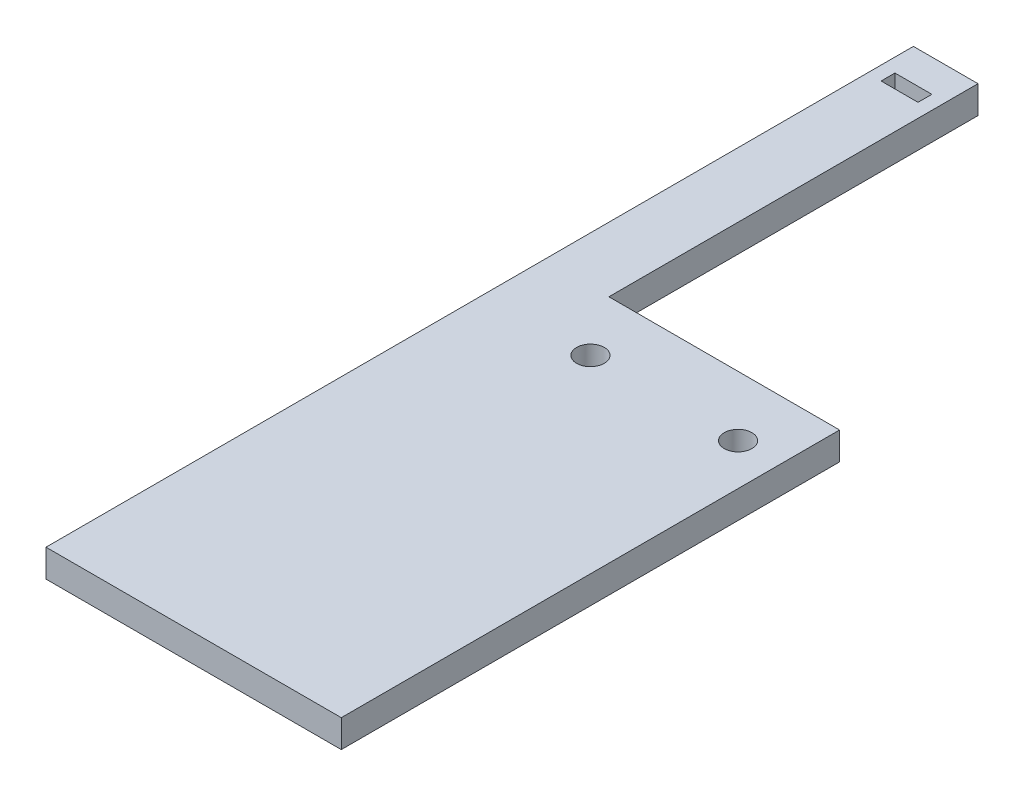
ISO-10303-21;
HEADER;
FILE_DESCRIPTION(('STEP AP214'),'2;1');
FILE_NAME('part.step','',(''),(''),'','','');
FILE_SCHEMA(('AUTOMOTIVE_DESIGN { 1 0 10303 214 1 1 1 1 }'));
ENDSEC;
DATA;
#1=APPLICATION_CONTEXT('core data for automotive mechanical design processes');
#2=APPLICATION_PROTOCOL_DEFINITION('international standard','automotive_design',2000,#1);
#3=PRODUCT_CONTEXT('',#1,'mechanical');
#4=PRODUCT('Part','Part','',(#3));
#5=PRODUCT_RELATED_PRODUCT_CATEGORY('part','',(#4));
#6=PRODUCT_DEFINITION_FORMATION('','',#4);
#7=PRODUCT_DEFINITION_CONTEXT('part definition',#1,'design');
#8=PRODUCT_DEFINITION('design','',#6,#7);
#9=PRODUCT_DEFINITION_SHAPE('','',#8);
#10=(LENGTH_UNIT() NAMED_UNIT(*) SI_UNIT(.MILLI.,.METRE.));
#11=(NAMED_UNIT(*) PLANE_ANGLE_UNIT() SI_UNIT($,.RADIAN.));
#12=(NAMED_UNIT(*) SI_UNIT($,.STERADIAN.) SOLID_ANGLE_UNIT());
#13=UNCERTAINTY_MEASURE_WITH_UNIT(LENGTH_MEASURE(1.E-05),#10,'distance_accuracy_value','');
#14=(GEOMETRIC_REPRESENTATION_CONTEXT(3) GLOBAL_UNCERTAINTY_ASSIGNED_CONTEXT((#13)) GLOBAL_UNIT_ASSIGNED_CONTEXT((#10,
#11,#12)) REPRESENTATION_CONTEXT('',''));
#15=CARTESIAN_POINT('',(0.,0.,0.));
#16=DIRECTION('',(0.,0.,1.));
#17=DIRECTION('',(1.,0.,0.));
#18=AXIS2_PLACEMENT_3D('',#15,#16,#17);
#19=CARTESIAN_POINT('',(0.,3.,0.));
#20=DIRECTION('',(0.,-1.,0.));
#21=DIRECTION('',(0.,0.,-1.));
#22=AXIS2_PLACEMENT_3D('',#19,#20,#21);
#23=PLANE('',#22);
#24=CARTESIAN_POINT('',(11.5,3.,-47.5));
#25=DIRECTION('',(0.,1.,0.));
#26=DIRECTION('',(0.,0.,1.));
#27=AXIS2_PLACEMENT_3D('',#24,#25,#26);
#28=CIRCLE('',#27,1.5);
#29=CARTESIAN_POINT('',(11.5,3.,-46.));
#30=VERTEX_POINT('',#29);
#31=EDGE_CURVE('E167',#30,#30,#28,.T.);
#32=ORIENTED_EDGE('',*,*,#31,.F.);
#33=EDGE_LOOP('',(#32));
#34=FACE_BOUND('',#33,.T.);
#35=CARTESIAN_POINT('',(27.5,3.,-47.5));
#36=DIRECTION('',(0.,1.,0.));
#37=DIRECTION('',(0.,0.,1.));
#38=AXIS2_PLACEMENT_3D('',#35,#36,#37);
#39=CIRCLE('',#38,1.5);
#40=CARTESIAN_POINT('',(27.5,3.,-46.));
#41=VERTEX_POINT('',#40);
#42=EDGE_CURVE('E172',#41,#41,#39,.T.);
#43=ORIENTED_EDGE('',*,*,#42,.F.);
#44=EDGE_LOOP('',(#43));
#45=FACE_BOUND('',#44,.T.);
#46=DIRECTION('',(1.,0.,0.));
#47=VECTOR('',#46,1.);
#48=CARTESIAN_POINT('',(0.,3.,0.));
#49=LINE('',#48,#47);
#50=CARTESIAN_POINT('',(0.,3.,0.));
#51=VERTEX_POINT('',#50);
#52=CARTESIAN_POINT('',(32.,3.,0.));
#53=VERTEX_POINT('',#52);
#54=EDGE_CURVE('E127',#51,#53,#49,.T.);
#55=ORIENTED_EDGE('',*,*,#54,.T.);
#56=DIRECTION('',(0.,0.,1.));
#57=VECTOR('',#56,1.);
#58=CARTESIAN_POINT('',(32.,3.,-94.));
#59=LINE('',#58,#57);
#60=CARTESIAN_POINT('',(32.,3.,-54.));
#61=VERTEX_POINT('',#60);
#62=EDGE_CURVE('E116',#61,#53,#59,.T.);
#63=ORIENTED_EDGE('',*,*,#62,.F.);
#64=DIRECTION('',(-1.,0.,0.));
#65=VECTOR('',#64,1.);
#66=CARTESIAN_POINT('',(7.,3.,-54.));
#67=LINE('',#66,#65);
#68=CARTESIAN_POINT('',(7.,3.,-54.));
#69=VERTEX_POINT('',#68);
#70=EDGE_CURVE('E136',#61,#69,#67,.T.);
#71=ORIENTED_EDGE('',*,*,#70,.T.);
#72=DIRECTION('',(0.,0.,-1.));
#73=VECTOR('',#72,1.);
#74=CARTESIAN_POINT('',(7.,3.,-94.));
#75=LINE('',#74,#73);
#76=CARTESIAN_POINT('',(7.,3.,-94.));
#77=VERTEX_POINT('',#76);
#78=EDGE_CURVE('E138',#69,#77,#75,.T.);
#79=ORIENTED_EDGE('',*,*,#78,.T.);
#80=DIRECTION('',(-1.,0.,0.));
#81=VECTOR('',#80,1.);
#82=CARTESIAN_POINT('',(0.,3.,-94.));
#83=LINE('',#82,#81);
#84=CARTESIAN_POINT('',(0.,3.,-94.));
#85=VERTEX_POINT('',#84);
#86=EDGE_CURVE('E145',#77,#85,#83,.T.);
#87=ORIENTED_EDGE('',*,*,#86,.T.);
#88=DIRECTION('',(0.,0.,1.));
#89=VECTOR('',#88,1.);
#90=CARTESIAN_POINT('',(0.,3.,0.));
#91=LINE('',#90,#89);
#92=EDGE_CURVE('E134',#85,#51,#91,.T.);
#93=ORIENTED_EDGE('',*,*,#92,.T.);
#94=EDGE_LOOP('',(#55,#63,#71,#79,#87,#93));
#95=FACE_BOUND('',#94,.T.);
#96=DIRECTION('',(0.,0.,1.));
#97=VECTOR('',#96,1.);
#98=CARTESIAN_POINT('',(1.5,3.,-90.5));
#99=LINE('',#98,#97);
#100=CARTESIAN_POINT('',(1.5,3.,-90.5));
#101=VERTEX_POINT('',#100);
#102=CARTESIAN_POINT('',(1.5,3.,-89.));
#103=VERTEX_POINT('',#102);
#104=EDGE_CURVE('E181',#101,#103,#99,.T.);
#105=ORIENTED_EDGE('',*,*,#104,.F.);
#106=DIRECTION('',(-1.,0.,0.));
#107=VECTOR('',#106,1.);
#108=CARTESIAN_POINT('',(1.5,3.,-90.5));
#109=LINE('',#108,#107);
#110=CARTESIAN_POINT('',(5.5,3.,-90.5));
#111=VERTEX_POINT('',#110);
#112=EDGE_CURVE('E188',#111,#101,#109,.T.);
#113=ORIENTED_EDGE('',*,*,#112,.F.);
#114=DIRECTION('',(0.,0.,-1.));
#115=VECTOR('',#114,1.);
#116=CARTESIAN_POINT('',(5.5,3.,-90.5));
#117=LINE('',#116,#115);
#118=CARTESIAN_POINT('',(5.5,3.,-89.));
#119=VERTEX_POINT('',#118);
#120=EDGE_CURVE('E186',#119,#111,#117,.T.);
#121=ORIENTED_EDGE('',*,*,#120,.F.);
#122=DIRECTION('',(1.,0.,0.));
#123=VECTOR('',#122,1.);
#124=CARTESIAN_POINT('',(1.5,3.,-89.));
#125=LINE('',#124,#123);
#126=EDGE_CURVE('E183',#103,#119,#125,.T.);
#127=ORIENTED_EDGE('',*,*,#126,.F.);
#128=EDGE_LOOP('',(#105,#113,#121,#127));
#129=FACE_BOUND('',#128,.T.);
#130=ADVANCED_FACE('F40',(#34,#45,#95,#129),#23,.F.);
#131=CARTESIAN_POINT('',(0.,0.,0.));
#132=DIRECTION('',(0.,-1.,0.));
#133=DIRECTION('',(0.,0.,-1.));
#134=AXIS2_PLACEMENT_3D('',#131,#132,#133);
#135=PLANE('',#134);
#136=CARTESIAN_POINT('',(11.5,0.,-47.5));
#137=DIRECTION('',(0.,-1.,0.));
#138=DIRECTION('',(0.,0.,-1.));
#139=AXIS2_PLACEMENT_3D('',#136,#137,#138);
#140=CIRCLE('',#139,1.5);
#141=CARTESIAN_POINT('',(11.5,0.,-49.));
#142=VERTEX_POINT('',#141);
#143=EDGE_CURVE('E44',#142,#142,#140,.T.);
#144=ORIENTED_EDGE('',*,*,#143,.F.);
#145=EDGE_LOOP('',(#144));
#146=FACE_BOUND('',#145,.T.);
#147=CARTESIAN_POINT('',(27.5,0.,-47.5));
#148=DIRECTION('',(0.,-1.,0.));
#149=DIRECTION('',(0.,0.,-1.));
#150=AXIS2_PLACEMENT_3D('',#147,#148,#149);
#151=CIRCLE('',#150,1.5);
#152=CARTESIAN_POINT('',(27.5,0.,-49.));
#153=VERTEX_POINT('',#152);
#154=EDGE_CURVE('E165',#153,#153,#151,.T.);
#155=ORIENTED_EDGE('',*,*,#154,.F.);
#156=EDGE_LOOP('',(#155));
#157=FACE_BOUND('',#156,.T.);
#158=DIRECTION('',(0.,0.,1.));
#159=VECTOR('',#158,1.);
#160=CARTESIAN_POINT('',(32.,0.,-94.));
#161=LINE('',#160,#159);
#162=CARTESIAN_POINT('',(32.,0.,-54.));
#163=VERTEX_POINT('',#162);
#164=CARTESIAN_POINT('',(32.,0.,0.));
#165=VERTEX_POINT('',#164);
#166=EDGE_CURVE('E57',#163,#165,#161,.T.);
#167=ORIENTED_EDGE('',*,*,#166,.T.);
#168=DIRECTION('',(1.,0.,0.));
#169=VECTOR('',#168,1.);
#170=CARTESIAN_POINT('',(0.,0.,0.));
#171=LINE('',#170,#169);
#172=CARTESIAN_POINT('',(0.,0.,0.));
#173=VERTEX_POINT('',#172);
#174=EDGE_CURVE('E130',#173,#165,#171,.T.);
#175=ORIENTED_EDGE('',*,*,#174,.F.);
#176=DIRECTION('',(0.,0.,1.));
#177=VECTOR('',#176,1.);
#178=CARTESIAN_POINT('',(0.,0.,-54.));
#179=LINE('',#178,#177);
#180=CARTESIAN_POINT('',(0.,0.,-94.));
#181=VERTEX_POINT('',#180);
#182=EDGE_CURVE('E140',#181,#173,#179,.T.);
#183=ORIENTED_EDGE('',*,*,#182,.F.);
#184=DIRECTION('',(-1.,0.,0.));
#185=VECTOR('',#184,1.);
#186=CARTESIAN_POINT('',(0.,0.,-94.));
#187=LINE('',#186,#185);
#188=CARTESIAN_POINT('',(7.,0.,-94.));
#189=VERTEX_POINT('',#188);
#190=EDGE_CURVE('E154',#189,#181,#187,.T.);
#191=ORIENTED_EDGE('',*,*,#190,.F.);
#192=DIRECTION('',(0.,0.,-1.));
#193=VECTOR('',#192,1.);
#194=CARTESIAN_POINT('',(7.,0.,-94.));
#195=LINE('',#194,#193);
#196=CARTESIAN_POINT('',(7.,0.,-54.));
#197=VERTEX_POINT('',#196);
#198=EDGE_CURVE('E152',#197,#189,#195,.T.);
#199=ORIENTED_EDGE('',*,*,#198,.F.);
#200=DIRECTION('',(-1.,0.,0.));
#201=VECTOR('',#200,1.);
#202=CARTESIAN_POINT('',(7.,0.,-54.));
#203=LINE('',#202,#201);
#204=EDGE_CURVE('E149',#163,#197,#203,.T.);
#205=ORIENTED_EDGE('',*,*,#204,.F.);
#206=EDGE_LOOP('',(#167,#175,#183,#191,#199,#205));
#207=FACE_BOUND('',#206,.T.);
#208=DIRECTION('',(-1.,0.,0.));
#209=VECTOR('',#208,1.);
#210=CARTESIAN_POINT('',(1.5,0.,-90.5));
#211=LINE('',#210,#209);
#212=CARTESIAN_POINT('',(5.5,0.,-90.5));
#213=VERTEX_POINT('',#212);
#214=CARTESIAN_POINT('',(1.5,0.,-90.5));
#215=VERTEX_POINT('',#214);
#216=EDGE_CURVE('E184',#213,#215,#211,.T.);
#217=ORIENTED_EDGE('',*,*,#216,.T.);
#218=DIRECTION('',(0.,0.,1.));
#219=VECTOR('',#218,1.);
#220=CARTESIAN_POINT('',(1.5,0.,-90.5));
#221=LINE('',#220,#219);
#222=CARTESIAN_POINT('',(1.5,0.,-89.));
#223=VERTEX_POINT('',#222);
#224=EDGE_CURVE('E179',#215,#223,#221,.T.);
#225=ORIENTED_EDGE('',*,*,#224,.T.);
#226=DIRECTION('',(1.,0.,0.));
#227=VECTOR('',#226,1.);
#228=CARTESIAN_POINT('',(1.5,0.,-89.));
#229=LINE('',#228,#227);
#230=CARTESIAN_POINT('',(5.5,0.,-89.));
#231=VERTEX_POINT('',#230);
#232=EDGE_CURVE('E193',#223,#231,#229,.T.);
#233=ORIENTED_EDGE('',*,*,#232,.T.);
#234=DIRECTION('',(0.,0.,-1.));
#235=VECTOR('',#234,1.);
#236=CARTESIAN_POINT('',(5.5,0.,-90.5));
#237=LINE('',#236,#235);
#238=EDGE_CURVE('E196',#231,#213,#237,.T.);
#239=ORIENTED_EDGE('',*,*,#238,.T.);
#240=EDGE_LOOP('',(#217,#225,#233,#239));
#241=FACE_BOUND('',#240,.T.);
#242=ADVANCED_FACE('F214',(#146,#157,#207,#241),#135,.T.);
#243=CARTESIAN_POINT('',(0.,3.,0.));
#244=DIRECTION('',(0.,0.,-1.));
#245=DIRECTION('',(-1.,0.,0.));
#246=AXIS2_PLACEMENT_3D('',#243,#244,#245);
#247=PLANE('',#246);
#248=ORIENTED_EDGE('',*,*,#174,.T.);
#249=DIRECTION('',(0.,-1.,0.));
#250=VECTOR('',#249,1.);
#251=CARTESIAN_POINT('',(32.,0.,0.));
#252=LINE('',#251,#250);
#253=EDGE_CURVE('E119',#53,#165,#252,.T.);
#254=ORIENTED_EDGE('',*,*,#253,.F.);
#255=ORIENTED_EDGE('',*,*,#54,.F.);
#256=DIRECTION('',(0.,-1.,0.));
#257=VECTOR('',#256,1.);
#258=CARTESIAN_POINT('',(0.,3.,0.));
#259=LINE('',#258,#257);
#260=EDGE_CURVE('E49',#51,#173,#259,.T.);
#261=ORIENTED_EDGE('',*,*,#260,.T.);
#262=EDGE_LOOP('',(#248,#254,#255,#261));
#263=FACE_BOUND('',#262,.T.);
#264=ADVANCED_FACE('F42',(#263),#247,.F.);
#265=CARTESIAN_POINT('',(7.,3.,-54.));
#266=DIRECTION('',(0.,0.,1.));
#267=DIRECTION('',(1.,0.,0.));
#268=AXIS2_PLACEMENT_3D('',#265,#266,#267);
#269=PLANE('',#268);
#270=ORIENTED_EDGE('',*,*,#70,.F.);
#271=DIRECTION('',(0.,-1.,0.));
#272=VECTOR('',#271,1.);
#273=CARTESIAN_POINT('',(32.,3.,-54.));
#274=LINE('',#273,#272);
#275=EDGE_CURVE('E11',#61,#163,#274,.T.);
#276=ORIENTED_EDGE('',*,*,#275,.T.);
#277=ORIENTED_EDGE('',*,*,#204,.T.);
#278=DIRECTION('',(0.,-1.,0.));
#279=VECTOR('',#278,1.);
#280=CARTESIAN_POINT('',(7.,3.,-54.));
#281=LINE('',#280,#279);
#282=EDGE_CURVE('E162',#69,#197,#281,.T.);
#283=ORIENTED_EDGE('',*,*,#282,.F.);
#284=EDGE_LOOP('',(#270,#276,#277,#283));
#285=FACE_BOUND('',#284,.T.);
#286=ADVANCED_FACE('F253',(#285),#269,.F.);
#287=CARTESIAN_POINT('',(7.,3.,-94.));
#288=DIRECTION('',(-1.,0.,0.));
#289=DIRECTION('',(0.,0.,1.));
#290=AXIS2_PLACEMENT_3D('',#287,#288,#289);
#291=PLANE('',#290);
#292=ORIENTED_EDGE('',*,*,#198,.T.);
#293=DIRECTION('',(0.,-1.,0.));
#294=VECTOR('',#293,1.);
#295=CARTESIAN_POINT('',(7.,3.,-94.));
#296=LINE('',#295,#294);
#297=EDGE_CURVE('E159',#77,#189,#296,.T.);
#298=ORIENTED_EDGE('',*,*,#297,.F.);
#299=ORIENTED_EDGE('',*,*,#78,.F.);
#300=ORIENTED_EDGE('',*,*,#282,.T.);
#301=EDGE_LOOP('',(#292,#298,#299,#300));
#302=FACE_BOUND('',#301,.T.);
#303=ADVANCED_FACE('F250',(#302),#291,.F.);
#304=CARTESIAN_POINT('',(0.,3.,-94.));
#305=DIRECTION('',(0.,0.,1.));
#306=DIRECTION('',(1.,0.,0.));
#307=AXIS2_PLACEMENT_3D('',#304,#305,#306);
#308=PLANE('',#307);
#309=ORIENTED_EDGE('',*,*,#190,.T.);
#310=DIRECTION('',(0.,-1.,0.));
#311=VECTOR('',#310,1.);
#312=CARTESIAN_POINT('',(0.,3.,-94.));
#313=LINE('',#312,#311);
#314=EDGE_CURVE('E147',#85,#181,#313,.T.);
#315=ORIENTED_EDGE('',*,*,#314,.F.);
#316=ORIENTED_EDGE('',*,*,#86,.F.);
#317=ORIENTED_EDGE('',*,*,#297,.T.);
#318=EDGE_LOOP('',(#309,#315,#316,#317));
#319=FACE_BOUND('',#318,.T.);
#320=ADVANCED_FACE('F246',(#319),#308,.F.);
#321=CARTESIAN_POINT('',(0.,3.,-54.));
#322=DIRECTION('',(1.,0.,0.));
#323=DIRECTION('',(0.,0.,-1.));
#324=AXIS2_PLACEMENT_3D('',#321,#322,#323);
#325=PLANE('',#324);
#326=ORIENTED_EDGE('',*,*,#182,.T.);
#327=ORIENTED_EDGE('',*,*,#260,.F.);
#328=ORIENTED_EDGE('',*,*,#92,.F.);
#329=ORIENTED_EDGE('',*,*,#314,.T.);
#330=EDGE_LOOP('',(#326,#327,#328,#329));
#331=FACE_BOUND('',#330,.T.);
#332=ADVANCED_FACE('F243',(#331),#325,.F.);
#333=CARTESIAN_POINT('',(1.5,3.,-90.5));
#334=DIRECTION('',(1.,0.,0.));
#335=DIRECTION('',(0.,0.,-1.));
#336=AXIS2_PLACEMENT_3D('',#333,#334,#335);
#337=PLANE('',#336);
#338=ORIENTED_EDGE('',*,*,#224,.F.);
#339=DIRECTION('',(0.,-1.,0.));
#340=VECTOR('',#339,1.);
#341=CARTESIAN_POINT('',(1.5,3.,-90.5));
#342=LINE('',#341,#340);
#343=EDGE_CURVE('E190',#101,#215,#342,.T.);
#344=ORIENTED_EDGE('',*,*,#343,.F.);
#345=ORIENTED_EDGE('',*,*,#104,.T.);
#346=DIRECTION('',(0.,-1.,0.));
#347=VECTOR('',#346,1.);
#348=CARTESIAN_POINT('',(1.5,3.,-89.));
#349=LINE('',#348,#347);
#350=EDGE_CURVE('E150',#103,#223,#349,.T.);
#351=ORIENTED_EDGE('',*,*,#350,.T.);
#352=EDGE_LOOP('',(#338,#344,#345,#351));
#353=FACE_BOUND('',#352,.T.);
#354=ADVANCED_FACE('F208',(#353),#337,.T.);
#355=CARTESIAN_POINT('',(1.5,3.,-89.));
#356=DIRECTION('',(0.,0.,-1.));
#357=DIRECTION('',(-1.,0.,0.));
#358=AXIS2_PLACEMENT_3D('',#355,#356,#357);
#359=PLANE('',#358);
#360=ORIENTED_EDGE('',*,*,#232,.F.);
#361=ORIENTED_EDGE('',*,*,#350,.F.);
#362=ORIENTED_EDGE('',*,*,#126,.T.);
#363=DIRECTION('',(0.,-1.,0.));
#364=VECTOR('',#363,1.);
#365=CARTESIAN_POINT('',(5.5,3.,-89.));
#366=LINE('',#365,#364);
#367=EDGE_CURVE('E204',#119,#231,#366,.T.);
#368=ORIENTED_EDGE('',*,*,#367,.T.);
#369=EDGE_LOOP('',(#360,#361,#362,#368));
#370=FACE_BOUND('',#369,.T.);
#371=ADVANCED_FACE('F220',(#370),#359,.T.);
#372=CARTESIAN_POINT('',(5.5,3.,-90.5));
#373=DIRECTION('',(-1.,0.,0.));
#374=DIRECTION('',(0.,0.,1.));
#375=AXIS2_PLACEMENT_3D('',#372,#373,#374);
#376=PLANE('',#375);
#377=ORIENTED_EDGE('',*,*,#238,.F.);
#378=ORIENTED_EDGE('',*,*,#367,.F.);
#379=ORIENTED_EDGE('',*,*,#120,.T.);
#380=DIRECTION('',(0.,-1.,0.));
#381=VECTOR('',#380,1.);
#382=CARTESIAN_POINT('',(5.5,3.,-90.5));
#383=LINE('',#382,#381);
#384=EDGE_CURVE('E64',#111,#213,#383,.T.);
#385=ORIENTED_EDGE('',*,*,#384,.T.);
#386=EDGE_LOOP('',(#377,#378,#379,#385));
#387=FACE_BOUND('',#386,.T.);
#388=ADVANCED_FACE('F222',(#387),#376,.T.);
#389=CARTESIAN_POINT('',(1.5,3.,-90.5));
#390=DIRECTION('',(0.,0.,1.));
#391=DIRECTION('',(1.,0.,0.));
#392=AXIS2_PLACEMENT_3D('',#389,#390,#391);
#393=PLANE('',#392);
#394=ORIENTED_EDGE('',*,*,#216,.F.);
#395=ORIENTED_EDGE('',*,*,#384,.F.);
#396=ORIENTED_EDGE('',*,*,#112,.T.);
#397=ORIENTED_EDGE('',*,*,#343,.T.);
#398=EDGE_LOOP('',(#394,#395,#396,#397));
#399=FACE_BOUND('',#398,.T.);
#400=ADVANCED_FACE('F216',(#399),#393,.T.);
#401=CARTESIAN_POINT('',(32.,0.,-94.));
#402=DIRECTION('',(-1.,0.,0.));
#403=DIRECTION('',(0.,0.,1.));
#404=AXIS2_PLACEMENT_3D('',#401,#402,#403);
#405=PLANE('',#404);
#406=ORIENTED_EDGE('',*,*,#62,.T.);
#407=ORIENTED_EDGE('',*,*,#253,.T.);
#408=ORIENTED_EDGE('',*,*,#166,.F.);
#409=ORIENTED_EDGE('',*,*,#275,.F.);
#410=EDGE_LOOP('',(#406,#407,#408,#409));
#411=FACE_BOUND('',#410,.T.);
#412=ADVANCED_FACE('F118',(#411),#405,.F.);
#413=CARTESIAN_POINT('',(27.5,-7.,-47.5));
#414=DIRECTION('',(0.,1.,0.));
#415=DIRECTION('',(0.,0.,1.));
#416=AXIS2_PLACEMENT_3D('',#413,#414,#415);
#417=CYLINDRICAL_SURFACE('',#416,1.5);
#418=ORIENTED_EDGE('',*,*,#154,.T.);
#419=EDGE_LOOP('',(#418));
#420=FACE_BOUND('',#419,.T.);
#421=ORIENTED_EDGE('',*,*,#42,.T.);
#422=EDGE_LOOP('',(#421));
#423=FACE_BOUND('',#422,.T.);
#424=ADVANCED_FACE('F291',(#420,#423),#417,.F.);
#425=CARTESIAN_POINT('',(11.5,-7.,-47.5));
#426=DIRECTION('',(0.,1.,0.));
#427=DIRECTION('',(0.,0.,1.));
#428=AXIS2_PLACEMENT_3D('',#425,#426,#427);
#429=CYLINDRICAL_SURFACE('',#428,1.5);
#430=ORIENTED_EDGE('',*,*,#143,.T.);
#431=EDGE_LOOP('',(#430));
#432=FACE_BOUND('',#431,.T.);
#433=ORIENTED_EDGE('',*,*,#31,.T.);
#434=EDGE_LOOP('',(#433));
#435=FACE_BOUND('',#434,.T.);
#436=ADVANCED_FACE('F300',(#432,#435),#429,.F.);
#437=CLOSED_SHELL('',(#130,#242,#264,#286,#303,#320,#332,#354,#371,#388,#400,#412,#424,#436));
#438=MANIFOLD_SOLID_BREP('B2',#437);
#439=ADVANCED_BREP_SHAPE_REPRESENTATION('',(#18,#438),#14);
#440=SHAPE_DEFINITION_REPRESENTATION(#9,#439);
ENDSEC;
END-ISO-10303-21;
